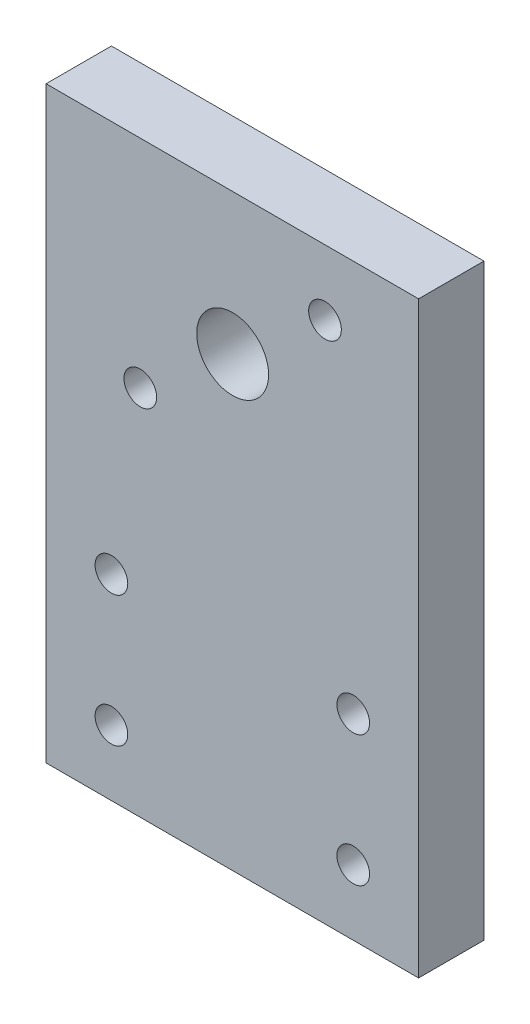
ISO-10303-21;
HEADER;
FILE_DESCRIPTION(('STEP AP214'),'2;1');
FILE_NAME('part.step','',(''),(''),'','','');
FILE_SCHEMA(('AUTOMOTIVE_DESIGN { 1 0 10303 214 1 1 1 1 }'));
ENDSEC;
DATA;
#1=APPLICATION_CONTEXT('core data for automotive mechanical design processes');
#2=APPLICATION_PROTOCOL_DEFINITION('international standard','automotive_design',2000,#1);
#3=PRODUCT_CONTEXT('',#1,'mechanical');
#4=PRODUCT('Part','Part','',(#3));
#5=PRODUCT_RELATED_PRODUCT_CATEGORY('part','',(#4));
#6=PRODUCT_DEFINITION_FORMATION('','',#4);
#7=PRODUCT_DEFINITION_CONTEXT('part definition',#1,'design');
#8=PRODUCT_DEFINITION('design','',#6,#7);
#9=PRODUCT_DEFINITION_SHAPE('','',#8);
#10=(LENGTH_UNIT() NAMED_UNIT(*) SI_UNIT(.MILLI.,.METRE.));
#11=(NAMED_UNIT(*) PLANE_ANGLE_UNIT() SI_UNIT($,.RADIAN.));
#12=(NAMED_UNIT(*) SI_UNIT($,.STERADIAN.) SOLID_ANGLE_UNIT());
#13=UNCERTAINTY_MEASURE_WITH_UNIT(LENGTH_MEASURE(1.E-05),#10,'distance_accuracy_value','');
#14=(GEOMETRIC_REPRESENTATION_CONTEXT(3) GLOBAL_UNCERTAINTY_ASSIGNED_CONTEXT((#13)) GLOBAL_UNIT_ASSIGNED_CONTEXT((#10,
#11,#12)) REPRESENTATION_CONTEXT('',''));
#15=CARTESIAN_POINT('',(0.,0.,0.));
#16=DIRECTION('',(0.,0.,1.));
#17=DIRECTION('',(1.,0.,0.));
#18=AXIS2_PLACEMENT_3D('',#15,#16,#17);
#19=CARTESIAN_POINT('',(0.,90.,10.));
#20=DIRECTION('',(1.,0.,0.));
#21=DIRECTION('',(0.,1.,0.));
#22=AXIS2_PLACEMENT_3D('',#19,#20,#21);
#23=PLANE('',#22);
#24=DIRECTION('',(0.,-1.,0.));
#25=VECTOR('',#24,1.);
#26=CARTESIAN_POINT('',(0.,90.,0.));
#27=LINE('',#26,#25);
#28=CARTESIAN_POINT('',(0.,90.,0.));
#29=VERTEX_POINT('',#28);
#30=CARTESIAN_POINT('',(0.,0.,0.));
#31=VERTEX_POINT('',#30);
#32=EDGE_CURVE('E111',#29,#31,#27,.T.);
#33=ORIENTED_EDGE('',*,*,#32,.T.);
#34=DIRECTION('',(0.,0.,-1.));
#35=VECTOR('',#34,1.);
#36=CARTESIAN_POINT('',(0.,0.,10.));
#37=LINE('',#36,#35);
#38=CARTESIAN_POINT('',(0.,0.,10.));
#39=VERTEX_POINT('',#38);
#40=EDGE_CURVE('E11',#39,#31,#37,.T.);
#41=ORIENTED_EDGE('',*,*,#40,.F.);
#42=DIRECTION('',(0.,-1.,0.));
#43=VECTOR('',#42,1.);
#44=CARTESIAN_POINT('',(0.,90.,10.));
#45=LINE('',#44,#43);
#46=CARTESIAN_POINT('',(0.,90.,10.));
#47=VERTEX_POINT('',#46);
#48=EDGE_CURVE('E95',#47,#39,#45,.T.);
#49=ORIENTED_EDGE('',*,*,#48,.F.);
#50=DIRECTION('',(0.,0.,-1.));
#51=VECTOR('',#50,1.);
#52=CARTESIAN_POINT('',(0.,90.,10.));
#53=LINE('',#52,#51);
#54=EDGE_CURVE('E107',#47,#29,#53,.T.);
#55=ORIENTED_EDGE('',*,*,#54,.T.);
#56=EDGE_LOOP('',(#33,#41,#49,#55));
#57=FACE_BOUND('',#56,.T.);
#58=ADVANCED_FACE('F43',(#57),#23,.F.);
#59=CARTESIAN_POINT('',(0.,0.,10.));
#60=DIRECTION('',(0.,1.,0.));
#61=DIRECTION('',(0.,0.,1.));
#62=AXIS2_PLACEMENT_3D('',#59,#60,#61);
#63=PLANE('',#62);
#64=DIRECTION('',(1.,0.,0.));
#65=VECTOR('',#64,1.);
#66=CARTESIAN_POINT('',(0.,0.,0.));
#67=LINE('',#66,#65);
#68=CARTESIAN_POINT('',(57.,0.,0.));
#69=VERTEX_POINT('',#68);
#70=EDGE_CURVE('E100',#31,#69,#67,.T.);
#71=ORIENTED_EDGE('',*,*,#70,.T.);
#72=DIRECTION('',(0.,0.,-1.));
#73=VECTOR('',#72,1.);
#74=CARTESIAN_POINT('',(57.,0.,10.));
#75=LINE('',#74,#73);
#76=CARTESIAN_POINT('',(57.,0.,10.));
#77=VERTEX_POINT('',#76);
#78=EDGE_CURVE('E52',#77,#69,#75,.T.);
#79=ORIENTED_EDGE('',*,*,#78,.F.);
#80=DIRECTION('',(1.,0.,0.));
#81=VECTOR('',#80,1.);
#82=CARTESIAN_POINT('',(0.,0.,10.));
#83=LINE('',#82,#81);
#84=EDGE_CURVE('E90',#39,#77,#83,.T.);
#85=ORIENTED_EDGE('',*,*,#84,.F.);
#86=ORIENTED_EDGE('',*,*,#40,.T.);
#87=EDGE_LOOP('',(#71,#79,#85,#86));
#88=FACE_BOUND('',#87,.T.);
#89=ADVANCED_FACE('F99',(#88),#63,.F.);
#90=CARTESIAN_POINT('',(57.,0.,10.));
#91=DIRECTION('',(-1.,0.,0.));
#92=DIRECTION('',(0.,-1.,0.));
#93=AXIS2_PLACEMENT_3D('',#90,#91,#92);
#94=PLANE('',#93);
#95=DIRECTION('',(0.,1.,0.));
#96=VECTOR('',#95,1.);
#97=CARTESIAN_POINT('',(57.,0.,0.));
#98=LINE('',#97,#96);
#99=CARTESIAN_POINT('',(57.,90.,0.));
#100=VERTEX_POINT('',#99);
#101=EDGE_CURVE('E77',#69,#100,#98,.T.);
#102=ORIENTED_EDGE('',*,*,#101,.T.);
#103=DIRECTION('',(0.,0.,-1.));
#104=VECTOR('',#103,1.);
#105=CARTESIAN_POINT('',(57.,90.,10.));
#106=LINE('',#105,#104);
#107=CARTESIAN_POINT('',(57.,90.,10.));
#108=VERTEX_POINT('',#107);
#109=EDGE_CURVE('E102',#108,#100,#106,.T.);
#110=ORIENTED_EDGE('',*,*,#109,.F.);
#111=DIRECTION('',(0.,1.,0.));
#112=VECTOR('',#111,1.);
#113=CARTESIAN_POINT('',(57.,0.,10.));
#114=LINE('',#113,#112);
#115=EDGE_CURVE('E93',#77,#108,#114,.T.);
#116=ORIENTED_EDGE('',*,*,#115,.F.);
#117=ORIENTED_EDGE('',*,*,#78,.T.);
#118=EDGE_LOOP('',(#102,#110,#116,#117));
#119=FACE_BOUND('',#118,.T.);
#120=ADVANCED_FACE('F103',(#119),#94,.F.);
#121=CARTESIAN_POINT('',(57.,90.,10.));
#122=DIRECTION('',(0.,-1.,0.));
#123=DIRECTION('',(0.,0.,-1.));
#124=AXIS2_PLACEMENT_3D('',#121,#122,#123);
#125=PLANE('',#124);
#126=DIRECTION('',(-1.,0.,0.));
#127=VECTOR('',#126,1.);
#128=CARTESIAN_POINT('',(57.,90.,0.));
#129=LINE('',#128,#127);
#130=EDGE_CURVE('E83',#100,#29,#129,.T.);
#131=ORIENTED_EDGE('',*,*,#130,.T.);
#132=ORIENTED_EDGE('',*,*,#54,.F.);
#133=DIRECTION('',(-1.,0.,0.));
#134=VECTOR('',#133,1.);
#135=CARTESIAN_POINT('',(57.,90.,10.));
#136=LINE('',#135,#134);
#137=EDGE_CURVE('E60',#108,#47,#136,.T.);
#138=ORIENTED_EDGE('',*,*,#137,.F.);
#139=ORIENTED_EDGE('',*,*,#109,.T.);
#140=EDGE_LOOP('',(#131,#132,#138,#139));
#141=FACE_BOUND('',#140,.T.);
#142=ADVANCED_FACE('F125',(#141),#125,.F.);
#143=CARTESIAN_POINT('',(0.,0.,10.));
#144=DIRECTION('',(0.,0.,1.));
#145=DIRECTION('',(1.,0.,0.));
#146=AXIS2_PLACEMENT_3D('',#143,#144,#145);
#147=PLANE('',#146);
#148=CARTESIAN_POINT('',(47.,10.,10.));
#149=DIRECTION('',(0.,0.,1.));
#150=DIRECTION('',(1.,0.,0.));
#151=AXIS2_PLACEMENT_3D('',#148,#149,#150);
#152=CIRCLE('',#151,2.5);
#153=CARTESIAN_POINT('',(49.5,10.,10.));
#154=VERTEX_POINT('',#153);
#155=EDGE_CURVE('E136',#154,#154,#152,.T.);
#156=ORIENTED_EDGE('',*,*,#155,.F.);
#157=EDGE_LOOP('',(#156));
#158=FACE_BOUND('',#157,.T.);
#159=CARTESIAN_POINT('',(10.,10.,10.));
#160=DIRECTION('',(0.,0.,1.));
#161=DIRECTION('',(1.,0.,0.));
#162=AXIS2_PLACEMENT_3D('',#159,#160,#161);
#163=CIRCLE('',#162,2.5);
#164=CARTESIAN_POINT('',(12.5,10.,10.));
#165=VERTEX_POINT('',#164);
#166=EDGE_CURVE('E161',#165,#165,#163,.T.);
#167=ORIENTED_EDGE('',*,*,#166,.F.);
#168=EDGE_LOOP('',(#167));
#169=FACE_BOUND('',#168,.T.);
#170=CARTESIAN_POINT('',(10.,30.,10.));
#171=DIRECTION('',(0.,0.,1.));
#172=DIRECTION('',(1.,0.,0.));
#173=AXIS2_PLACEMENT_3D('',#170,#171,#172);
#174=CIRCLE('',#173,2.5);
#175=CARTESIAN_POINT('',(12.5,30.,10.));
#176=VERTEX_POINT('',#175);
#177=EDGE_CURVE('E153',#176,#176,#174,.T.);
#178=ORIENTED_EDGE('',*,*,#177,.F.);
#179=EDGE_LOOP('',(#178));
#180=FACE_BOUND('',#179,.T.);
#181=CARTESIAN_POINT('',(28.55,68.45,10.));
#182=DIRECTION('',(0.,0.,1.));
#183=DIRECTION('',(1.,0.,0.));
#184=AXIS2_PLACEMENT_3D('',#181,#182,#183);
#185=CIRCLE('',#184,5.5);
#186=CARTESIAN_POINT('',(34.05,68.45,10.));
#187=VERTEX_POINT('',#186);
#188=EDGE_CURVE('E144',#187,#187,#185,.T.);
#189=ORIENTED_EDGE('',*,*,#188,.F.);
#190=EDGE_LOOP('',(#189));
#191=FACE_BOUND('',#190,.T.);
#192=CARTESIAN_POINT('',(14.4198903047429,56.9,10.));
#193=DIRECTION('',(0.,0.,1.));
#194=DIRECTION('',(1.,0.,0.));
#195=AXIS2_PLACEMENT_3D('',#192,#193,#194);
#196=CIRCLE('',#195,2.5);
#197=CARTESIAN_POINT('',(16.9198903047429,56.9,10.));
#198=VERTEX_POINT('',#197);
#199=EDGE_CURVE('E145',#198,#198,#196,.T.);
#200=ORIENTED_EDGE('',*,*,#199,.F.);
#201=EDGE_LOOP('',(#200));
#202=FACE_BOUND('',#201,.T.);
#203=CARTESIAN_POINT('',(42.6801096952571,80.,10.));
#204=DIRECTION('',(0.,0.,1.));
#205=DIRECTION('',(1.,0.,0.));
#206=AXIS2_PLACEMENT_3D('',#203,#204,#205);
#207=CIRCLE('',#206,2.5);
#208=CARTESIAN_POINT('',(45.1801096952571,80.,10.));
#209=VERTEX_POINT('',#208);
#210=EDGE_CURVE('E176',#209,#209,#207,.T.);
#211=ORIENTED_EDGE('',*,*,#210,.F.);
#212=EDGE_LOOP('',(#211));
#213=FACE_BOUND('',#212,.T.);
#214=CARTESIAN_POINT('',(47.,30.,10.));
#215=DIRECTION('',(0.,0.,1.));
#216=DIRECTION('',(1.,0.,0.));
#217=AXIS2_PLACEMENT_3D('',#214,#215,#216);
#218=CIRCLE('',#217,2.49999999999999);
#219=CARTESIAN_POINT('',(49.5,30.,10.));
#220=VERTEX_POINT('',#219);
#221=EDGE_CURVE('E132',#220,#220,#218,.T.);
#222=ORIENTED_EDGE('',*,*,#221,.F.);
#223=EDGE_LOOP('',(#222));
#224=FACE_BOUND('',#223,.T.);
#225=ORIENTED_EDGE('',*,*,#48,.T.);
#226=ORIENTED_EDGE('',*,*,#84,.T.);
#227=ORIENTED_EDGE('',*,*,#115,.T.);
#228=ORIENTED_EDGE('',*,*,#137,.T.);
#229=EDGE_LOOP('',(#225,#226,#227,#228));
#230=FACE_BOUND('',#229,.T.);
#231=ADVANCED_FACE('F91',(#158,#169,#180,#191,#202,#213,#224,#230),#147,.T.);
#232=CARTESIAN_POINT('',(0.,0.,0.));
#233=DIRECTION('',(0.,0.,1.));
#234=DIRECTION('',(1.,0.,0.));
#235=AXIS2_PLACEMENT_3D('',#232,#233,#234);
#236=PLANE('',#235);
#237=CARTESIAN_POINT('',(47.,10.,0.));
#238=DIRECTION('',(0.,0.,1.));
#239=DIRECTION('',(1.,0.,0.));
#240=AXIS2_PLACEMENT_3D('',#237,#238,#239);
#241=CIRCLE('',#240,2.5);
#242=CARTESIAN_POINT('',(49.5,10.,0.));
#243=VERTEX_POINT('',#242);
#244=EDGE_CURVE('E165',#243,#243,#241,.T.);
#245=ORIENTED_EDGE('',*,*,#244,.T.);
#246=EDGE_LOOP('',(#245));
#247=FACE_BOUND('',#246,.T.);
#248=CARTESIAN_POINT('',(10.,10.,0.));
#249=DIRECTION('',(0.,0.,1.));
#250=DIRECTION('',(1.,0.,0.));
#251=AXIS2_PLACEMENT_3D('',#248,#249,#250);
#252=CIRCLE('',#251,2.5);
#253=CARTESIAN_POINT('',(12.5,10.,0.));
#254=VERTEX_POINT('',#253);
#255=EDGE_CURVE('E157',#254,#254,#252,.T.);
#256=ORIENTED_EDGE('',*,*,#255,.T.);
#257=EDGE_LOOP('',(#256));
#258=FACE_BOUND('',#257,.T.);
#259=CARTESIAN_POINT('',(10.,30.,0.));
#260=DIRECTION('',(0.,0.,1.));
#261=DIRECTION('',(1.,0.,0.));
#262=AXIS2_PLACEMENT_3D('',#259,#260,#261);
#263=CIRCLE('',#262,2.5);
#264=CARTESIAN_POINT('',(12.5,30.,0.));
#265=VERTEX_POINT('',#264);
#266=EDGE_CURVE('E149',#265,#265,#263,.T.);
#267=ORIENTED_EDGE('',*,*,#266,.T.);
#268=EDGE_LOOP('',(#267));
#269=FACE_BOUND('',#268,.T.);
#270=CARTESIAN_POINT('',(28.55,68.45,0.));
#271=DIRECTION('',(0.,0.,1.));
#272=DIRECTION('',(1.,0.,0.));
#273=AXIS2_PLACEMENT_3D('',#270,#271,#272);
#274=CIRCLE('',#273,5.5);
#275=CARTESIAN_POINT('',(34.05,68.45,0.));
#276=VERTEX_POINT('',#275);
#277=EDGE_CURVE('E140',#276,#276,#274,.T.);
#278=ORIENTED_EDGE('',*,*,#277,.T.);
#279=EDGE_LOOP('',(#278));
#280=FACE_BOUND('',#279,.T.);
#281=CARTESIAN_POINT('',(14.4198903047429,56.9,0.));
#282=DIRECTION('',(0.,0.,1.));
#283=DIRECTION('',(1.,0.,0.));
#284=AXIS2_PLACEMENT_3D('',#281,#282,#283);
#285=CIRCLE('',#284,2.5);
#286=CARTESIAN_POINT('',(16.9198903047429,56.9,0.));
#287=VERTEX_POINT('',#286);
#288=EDGE_CURVE('E180',#287,#287,#285,.T.);
#289=ORIENTED_EDGE('',*,*,#288,.T.);
#290=EDGE_LOOP('',(#289));
#291=FACE_BOUND('',#290,.T.);
#292=CARTESIAN_POINT('',(42.6801096952571,80.,0.));
#293=DIRECTION('',(0.,0.,1.));
#294=DIRECTION('',(1.,0.,0.));
#295=AXIS2_PLACEMENT_3D('',#292,#293,#294);
#296=CIRCLE('',#295,2.5);
#297=CARTESIAN_POINT('',(45.1801096952571,80.,0.));
#298=VERTEX_POINT('',#297);
#299=EDGE_CURVE('E172',#298,#298,#296,.T.);
#300=ORIENTED_EDGE('',*,*,#299,.T.);
#301=EDGE_LOOP('',(#300));
#302=FACE_BOUND('',#301,.T.);
#303=CARTESIAN_POINT('',(47.,30.,0.));
#304=DIRECTION('',(0.,0.,1.));
#305=DIRECTION('',(1.,0.,0.));
#306=AXIS2_PLACEMENT_3D('',#303,#304,#305);
#307=CIRCLE('',#306,2.49999999999999);
#308=CARTESIAN_POINT('',(49.5,30.,0.));
#309=VERTEX_POINT('',#308);
#310=EDGE_CURVE('E115',#309,#309,#307,.T.);
#311=ORIENTED_EDGE('',*,*,#310,.T.);
#312=EDGE_LOOP('',(#311));
#313=FACE_BOUND('',#312,.T.);
#314=ORIENTED_EDGE('',*,*,#32,.F.);
#315=ORIENTED_EDGE('',*,*,#130,.F.);
#316=ORIENTED_EDGE('',*,*,#101,.F.);
#317=ORIENTED_EDGE('',*,*,#70,.F.);
#318=EDGE_LOOP('',(#314,#315,#316,#317));
#319=FACE_BOUND('',#318,.T.);
#320=ADVANCED_FACE('F128',(#247,#258,#269,#280,#291,#302,#313,#319),#236,.F.);
#321=CARTESIAN_POINT('',(47.,30.,0.));
#322=DIRECTION('',(0.,0.,1.));
#323=DIRECTION('',(1.,0.,0.));
#324=AXIS2_PLACEMENT_3D('',#321,#322,#323);
#325=CYLINDRICAL_SURFACE('',#324,2.49999999999999);
#326=ORIENTED_EDGE('',*,*,#310,.F.);
#327=EDGE_LOOP('',(#326));
#328=FACE_BOUND('',#327,.T.);
#329=ORIENTED_EDGE('',*,*,#221,.T.);
#330=EDGE_LOOP('',(#329));
#331=FACE_BOUND('',#330,.T.);
#332=ADVANCED_FACE('F198',(#328,#331),#325,.F.);
#333=CARTESIAN_POINT('',(42.6801096952571,80.,0.));
#334=DIRECTION('',(0.,0.,1.));
#335=DIRECTION('',(1.,0.,0.));
#336=AXIS2_PLACEMENT_3D('',#333,#334,#335);
#337=CYLINDRICAL_SURFACE('',#336,2.5);
#338=ORIENTED_EDGE('',*,*,#299,.F.);
#339=EDGE_LOOP('',(#338));
#340=FACE_BOUND('',#339,.T.);
#341=ORIENTED_EDGE('',*,*,#210,.T.);
#342=EDGE_LOOP('',(#341));
#343=FACE_BOUND('',#342,.T.);
#344=ADVANCED_FACE('F200',(#340,#343),#337,.F.);
#345=CARTESIAN_POINT('',(14.4198903047429,56.9,0.));
#346=DIRECTION('',(0.,0.,1.));
#347=DIRECTION('',(1.,0.,0.));
#348=AXIS2_PLACEMENT_3D('',#345,#346,#347);
#349=CYLINDRICAL_SURFACE('',#348,2.5);
#350=ORIENTED_EDGE('',*,*,#288,.F.);
#351=EDGE_LOOP('',(#350));
#352=FACE_BOUND('',#351,.T.);
#353=ORIENTED_EDGE('',*,*,#199,.T.);
#354=EDGE_LOOP('',(#353));
#355=FACE_BOUND('',#354,.T.);
#356=ADVANCED_FACE('F188',(#352,#355),#349,.F.);
#357=CARTESIAN_POINT('',(28.55,68.45,0.));
#358=DIRECTION('',(0.,0.,1.));
#359=DIRECTION('',(1.,0.,0.));
#360=AXIS2_PLACEMENT_3D('',#357,#358,#359);
#361=CYLINDRICAL_SURFACE('',#360,5.5);
#362=ORIENTED_EDGE('',*,*,#277,.F.);
#363=EDGE_LOOP('',(#362));
#364=FACE_BOUND('',#363,.T.);
#365=ORIENTED_EDGE('',*,*,#188,.T.);
#366=EDGE_LOOP('',(#365));
#367=FACE_BOUND('',#366,.T.);
#368=ADVANCED_FACE('F257',(#364,#367),#361,.F.);
#369=CARTESIAN_POINT('',(10.,30.,0.));
#370=DIRECTION('',(0.,0.,1.));
#371=DIRECTION('',(1.,0.,0.));
#372=AXIS2_PLACEMENT_3D('',#369,#370,#371);
#373=CYLINDRICAL_SURFACE('',#372,2.5);
#374=ORIENTED_EDGE('',*,*,#266,.F.);
#375=EDGE_LOOP('',(#374));
#376=FACE_BOUND('',#375,.T.);
#377=ORIENTED_EDGE('',*,*,#177,.T.);
#378=EDGE_LOOP('',(#377));
#379=FACE_BOUND('',#378,.T.);
#380=ADVANCED_FACE('F268',(#376,#379),#373,.F.);
#381=CARTESIAN_POINT('',(10.,10.,0.));
#382=DIRECTION('',(0.,0.,1.));
#383=DIRECTION('',(1.,0.,0.));
#384=AXIS2_PLACEMENT_3D('',#381,#382,#383);
#385=CYLINDRICAL_SURFACE('',#384,2.5);
#386=ORIENTED_EDGE('',*,*,#255,.F.);
#387=EDGE_LOOP('',(#386));
#388=FACE_BOUND('',#387,.T.);
#389=ORIENTED_EDGE('',*,*,#166,.T.);
#390=EDGE_LOOP('',(#389));
#391=FACE_BOUND('',#390,.T.);
#392=ADVANCED_FACE('F278',(#388,#391),#385,.F.);
#393=CARTESIAN_POINT('',(47.,10.,0.));
#394=DIRECTION('',(0.,0.,1.));
#395=DIRECTION('',(1.,0.,0.));
#396=AXIS2_PLACEMENT_3D('',#393,#394,#395);
#397=CYLINDRICAL_SURFACE('',#396,2.5);
#398=ORIENTED_EDGE('',*,*,#244,.F.);
#399=EDGE_LOOP('',(#398));
#400=FACE_BOUND('',#399,.T.);
#401=ORIENTED_EDGE('',*,*,#155,.T.);
#402=EDGE_LOOP('',(#401));
#403=FACE_BOUND('',#402,.T.);
#404=ADVANCED_FACE('F289',(#400,#403),#397,.F.);
#405=CLOSED_SHELL('',(#58,#89,#120,#142,#231,#320,#332,#344,#356,#368,#380,#392,#404));
#406=MANIFOLD_SOLID_BREP('B2',#405);
#407=ADVANCED_BREP_SHAPE_REPRESENTATION('',(#18,#406),#14);
#408=SHAPE_DEFINITION_REPRESENTATION(#9,#407);
ENDSEC;
END-ISO-10303-21;
